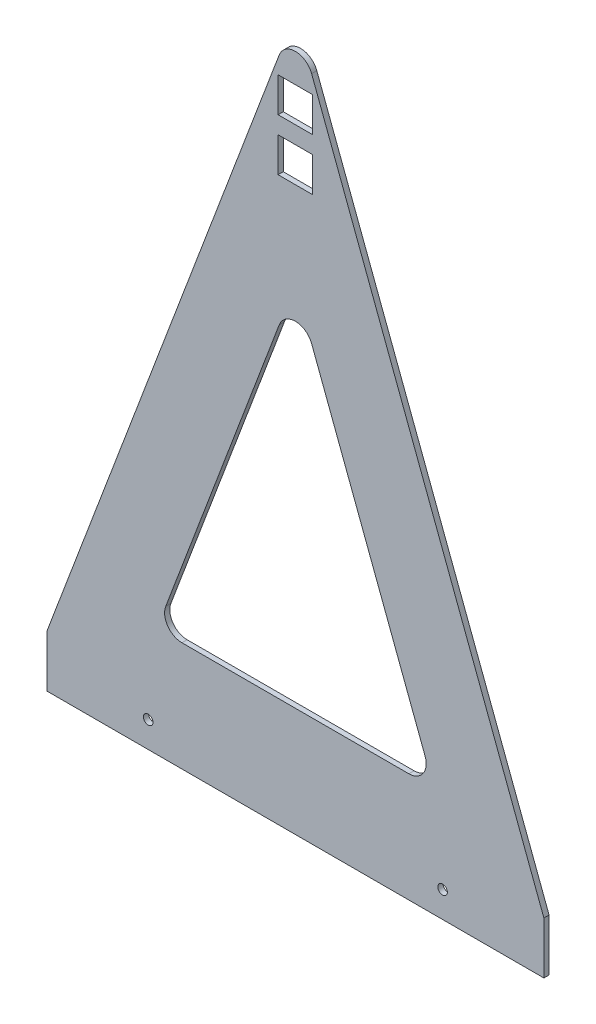
ISO-10303-21;
HEADER;
FILE_DESCRIPTION(('STEP AP214'),'2;1');
FILE_NAME('part.step','',(''),(''),'','','');
FILE_SCHEMA(('AUTOMOTIVE_DESIGN { 1 0 10303 214 1 1 1 1 }'));
ENDSEC;
DATA;
#1=APPLICATION_CONTEXT('core data for automotive mechanical design processes');
#2=APPLICATION_PROTOCOL_DEFINITION('international standard','automotive_design',2000,#1);
#3=PRODUCT_CONTEXT('',#1,'mechanical');
#4=PRODUCT('Part','Part','',(#3));
#5=PRODUCT_RELATED_PRODUCT_CATEGORY('part','',(#4));
#6=PRODUCT_DEFINITION_FORMATION('','',#4);
#7=PRODUCT_DEFINITION_CONTEXT('part definition',#1,'design');
#8=PRODUCT_DEFINITION('design','',#6,#7);
#9=PRODUCT_DEFINITION_SHAPE('','',#8);
#10=(LENGTH_UNIT() NAMED_UNIT(*) SI_UNIT(.MILLI.,.METRE.));
#11=(NAMED_UNIT(*) PLANE_ANGLE_UNIT() SI_UNIT($,.RADIAN.));
#12=(NAMED_UNIT(*) SI_UNIT($,.STERADIAN.) SOLID_ANGLE_UNIT());
#13=UNCERTAINTY_MEASURE_WITH_UNIT(LENGTH_MEASURE(1.E-05),#10,'distance_accuracy_value','');
#14=(GEOMETRIC_REPRESENTATION_CONTEXT(3) GLOBAL_UNCERTAINTY_ASSIGNED_CONTEXT((#13)) GLOBAL_UNIT_ASSIGNED_CONTEXT((#10,
#11,#12)) REPRESENTATION_CONTEXT('',''));
#15=CARTESIAN_POINT('',(0.,0.,0.));
#16=DIRECTION('',(0.,0.,1.));
#17=DIRECTION('',(1.,0.,0.));
#18=AXIS2_PLACEMENT_3D('',#15,#16,#17);
#19=CARTESIAN_POINT('',(0.,381.693910764514,3.));
#20=DIRECTION('',(0.,0.,1.));
#21=DIRECTION('',(1.,0.,0.));
#22=AXIS2_PLACEMENT_3D('',#19,#20,#21);
#23=PLANE('',#22);
#24=CARTESIAN_POINT('',(-65.5344110387045,73.1533101045285,3.));
#25=DIRECTION('',(0.,0.,-1.));
#26=DIRECTION('',(1.,0.,0.));
#27=AXIS2_PLACEMENT_3D('',#24,#25,#26);
#28=CIRCLE('',#27,10.);
#29=CARTESIAN_POINT('',(-65.5344110387045,63.1533101045285,3.));
#30=VERTEX_POINT('',#29);
#31=CARTESIAN_POINT('',(-74.8895840605347,76.686118864088,3.));
#32=VERTEX_POINT('',#31);
#33=EDGE_CURVE('E172',#30,#32,#28,.T.);
#34=ORIENTED_EDGE('',*,*,#33,.T.);
#35=DIRECTION('',(0.353280875955955,0.935517302183018,0.));
#36=VECTOR('',#35,1.);
#37=CARTESIAN_POINT('',(-9.35517302183021,250.226719524072,3.));
#38=LINE('',#37,#36);
#39=CARTESIAN_POINT('',(-9.35517302183022,250.226719524072,3.));
#40=VERTEX_POINT('',#39);
#41=EDGE_CURVE('E181',#32,#40,#38,.T.);
#42=ORIENTED_EDGE('',*,*,#41,.T.);
#43=CARTESIAN_POINT('',(0.,246.693910764513,3.));
#44=DIRECTION('',(0.,0.,-1.));
#45=DIRECTION('',(-1.,0.,0.));
#46=AXIS2_PLACEMENT_3D('',#43,#44,#45);
#47=CIRCLE('',#46,10.);
#48=CARTESIAN_POINT('',(9.35517302183021,250.226719524072,3.));
#49=VERTEX_POINT('',#48);
#50=EDGE_CURVE('E48',#40,#49,#47,.T.);
#51=ORIENTED_EDGE('',*,*,#50,.T.);
#52=DIRECTION('',(0.353280875955955,-0.935517302183018,0.));
#53=VECTOR('',#52,1.);
#54=CARTESIAN_POINT('',(9.35517302183021,250.226719524072,3.));
#55=LINE('',#54,#53);
#56=CARTESIAN_POINT('',(74.8895840605347,76.686118864088,3.));
#57=VERTEX_POINT('',#56);
#58=EDGE_CURVE('E195',#49,#57,#55,.T.);
#59=ORIENTED_EDGE('',*,*,#58,.T.);
#60=CARTESIAN_POINT('',(65.5344110387045,73.1533101045285,3.));
#61=DIRECTION('',(0.,0.,-1.));
#62=DIRECTION('',(-1.,0.,0.));
#63=AXIS2_PLACEMENT_3D('',#60,#61,#62);
#64=CIRCLE('',#63,10.);
#65=CARTESIAN_POINT('',(65.5344110387045,63.1533101045285,3.));
#66=VERTEX_POINT('',#65);
#67=EDGE_CURVE('E198',#57,#66,#64,.T.);
#68=ORIENTED_EDGE('',*,*,#67,.T.);
#69=DIRECTION('',(-1.,0.,0.));
#70=VECTOR('',#69,1.);
#71=CARTESIAN_POINT('',(-65.5344110387045,63.1533101045285,3.));
#72=LINE('',#71,#70);
#73=EDGE_CURVE('E178',#66,#30,#72,.T.);
#74=ORIENTED_EDGE('',*,*,#73,.T.);
#75=EDGE_LOOP('',(#34,#42,#51,#59,#68,#74));
#76=FACE_BOUND('',#75,.T.);
#77=CARTESIAN_POINT('',(85.,15.,3.));
#78=DIRECTION('',(0.,0.,-1.));
#79=DIRECTION('',(-1.,0.,0.));
#80=AXIS2_PLACEMENT_3D('',#77,#78,#79);
#81=CIRCLE('',#80,2.75);
#82=CARTESIAN_POINT('',(82.25,15.,3.));
#83=VERTEX_POINT('',#82);
#84=EDGE_CURVE('E224',#83,#83,#81,.T.);
#85=ORIENTED_EDGE('',*,*,#84,.T.);
#86=EDGE_LOOP('',(#85));
#87=FACE_BOUND('',#86,.T.);
#88=CARTESIAN_POINT('',(-85.,15.,3.));
#89=DIRECTION('',(0.,0.,-1.));
#90=DIRECTION('',(-1.,0.,0.));
#91=AXIS2_PLACEMENT_3D('',#88,#89,#90);
#92=CIRCLE('',#91,2.75);
#93=CARTESIAN_POINT('',(-87.75,15.,3.));
#94=VERTEX_POINT('',#93);
#95=EDGE_CURVE('E230',#94,#94,#92,.T.);
#96=ORIENTED_EDGE('',*,*,#95,.T.);
#97=EDGE_LOOP('',(#96));
#98=FACE_BOUND('',#97,.T.);
#99=DIRECTION('',(0.,1.,0.));
#100=VECTOR('',#99,1.);
#101=CARTESIAN_POINT('',(143.5,0.,3.));
#102=LINE('',#101,#100);
#103=CARTESIAN_POINT('',(143.5,0.,3.));
#104=VERTEX_POINT('',#103);
#105=CARTESIAN_POINT('',(143.5,30.,3.));
#106=VERTEX_POINT('',#105);
#107=EDGE_CURVE('E296',#104,#106,#102,.T.);
#108=ORIENTED_EDGE('',*,*,#107,.T.);
#109=DIRECTION('',(-0.353280875955956,0.935517302183018,0.));
#110=VECTOR('',#109,1.);
#111=CARTESIAN_POINT('',(143.5,30.,3.));
#112=LINE('',#111,#110);
#113=CARTESIAN_POINT('',(9.35517302183029,385.226719524073,3.));
#114=VERTEX_POINT('',#113);
#115=EDGE_CURVE('E299',#106,#114,#112,.T.);
#116=ORIENTED_EDGE('',*,*,#115,.T.);
#117=CARTESIAN_POINT('',(0.,381.693910764514,3.));
#118=DIRECTION('',(0.,0.,1.));
#119=DIRECTION('',(1.,0.,0.));
#120=AXIS2_PLACEMENT_3D('',#117,#118,#119);
#121=CIRCLE('',#120,10.);
#122=CARTESIAN_POINT('',(-9.35517302183028,385.226719524073,3.));
#123=VERTEX_POINT('',#122);
#124=EDGE_CURVE('E302',#114,#123,#121,.T.);
#125=ORIENTED_EDGE('',*,*,#124,.T.);
#126=DIRECTION('',(-0.353280875955955,-0.935517302183018,0.));
#127=VECTOR('',#126,1.);
#128=CARTESIAN_POINT('',(-143.5,29.9999999999991,3.));
#129=LINE('',#128,#127);
#130=CARTESIAN_POINT('',(-143.5,29.9999999999991,3.));
#131=VERTEX_POINT('',#130);
#132=EDGE_CURVE('E304',#123,#131,#129,.T.);
#133=ORIENTED_EDGE('',*,*,#132,.T.);
#134=DIRECTION('',(0.,-1.,0.));
#135=VECTOR('',#134,1.);
#136=CARTESIAN_POINT('',(-143.5,-8.88178419700125E-13,3.));
#137=LINE('',#136,#135);
#138=CARTESIAN_POINT('',(-143.5,-8.88178419700125E-13,3.));
#139=VERTEX_POINT('',#138);
#140=EDGE_CURVE('E306',#131,#139,#137,.T.);
#141=ORIENTED_EDGE('',*,*,#140,.T.);
#142=DIRECTION('',(1.,0.,0.));
#143=VECTOR('',#142,1.);
#144=CARTESIAN_POINT('',(-143.5,-8.88178419700125E-13,3.));
#145=LINE('',#144,#143);
#146=EDGE_CURVE('E308',#139,#104,#145,.T.);
#147=ORIENTED_EDGE('',*,*,#146,.T.);
#148=EDGE_LOOP('',(#108,#116,#125,#133,#141,#147));
#149=FACE_BOUND('',#148,.T.);
#150=DIRECTION('',(-1.,0.,0.));
#151=VECTOR('',#150,1.);
#152=CARTESIAN_POINT('',(-10.0000000000106,374.999999999999,3.));
#153=LINE('',#152,#151);
#154=CARTESIAN_POINT('',(9.99999999998945,374.999999999999,3.));
#155=VERTEX_POINT('',#154);
#156=CARTESIAN_POINT('',(-10.0000000000106,374.999999999999,3.));
#157=VERTEX_POINT('',#156);
#158=EDGE_CURVE('E267',#155,#157,#153,.T.);
#159=ORIENTED_EDGE('',*,*,#158,.F.);
#160=DIRECTION('',(0.,1.,0.));
#161=VECTOR('',#160,1.);
#162=CARTESIAN_POINT('',(9.99999999998945,374.999999999999,3.));
#163=LINE('',#162,#161);
#164=CARTESIAN_POINT('',(9.99999999998946,354.999999999999,3.));
#165=VERTEX_POINT('',#164);
#166=EDGE_CURVE('E265',#165,#155,#163,.T.);
#167=ORIENTED_EDGE('',*,*,#166,.F.);
#168=DIRECTION('',(1.,0.,0.));
#169=VECTOR('',#168,1.);
#170=CARTESIAN_POINT('',(-10.0000000000105,354.999999999999,3.));
#171=LINE('',#170,#169);
#172=CARTESIAN_POINT('',(-10.0000000000105,354.999999999999,3.));
#173=VERTEX_POINT('',#172);
#174=EDGE_CURVE('E273',#173,#165,#171,.T.);
#175=ORIENTED_EDGE('',*,*,#174,.F.);
#176=DIRECTION('',(0.,-1.,0.));
#177=VECTOR('',#176,1.);
#178=CARTESIAN_POINT('',(-10.0000000000106,374.999999999999,3.));
#179=LINE('',#178,#177);
#180=EDGE_CURVE('E270',#157,#173,#179,.T.);
#181=ORIENTED_EDGE('',*,*,#180,.F.);
#182=EDGE_LOOP('',(#159,#167,#175,#181));
#183=FACE_BOUND('',#182,.T.);
#184=DIRECTION('',(-1.,0.,0.));
#185=VECTOR('',#184,1.);
#186=CARTESIAN_POINT('',(-10.,345.,3.));
#187=LINE('',#186,#185);
#188=CARTESIAN_POINT('',(9.99999999998114,345.,3.));
#189=VERTEX_POINT('',#188);
#190=CARTESIAN_POINT('',(-10.,345.,3.));
#191=VERTEX_POINT('',#190);
#192=EDGE_CURVE('E236',#189,#191,#187,.T.);
#193=ORIENTED_EDGE('',*,*,#192,.F.);
#194=DIRECTION('',(0.,1.,0.));
#195=VECTOR('',#194,1.);
#196=CARTESIAN_POINT('',(9.99999999998114,345.,3.));
#197=LINE('',#196,#195);
#198=CARTESIAN_POINT('',(9.99999999998114,325.,3.));
#199=VERTEX_POINT('',#198);
#200=EDGE_CURVE('E234',#199,#189,#197,.T.);
#201=ORIENTED_EDGE('',*,*,#200,.F.);
#202=DIRECTION('',(1.,0.,0.));
#203=VECTOR('',#202,1.);
#204=CARTESIAN_POINT('',(-9.99999999999999,325.,3.));
#205=LINE('',#204,#203);
#206=CARTESIAN_POINT('',(-9.99999999999999,325.,3.));
#207=VERTEX_POINT('',#206);
#208=EDGE_CURVE('E242',#207,#199,#205,.T.);
#209=ORIENTED_EDGE('',*,*,#208,.F.);
#210=DIRECTION('',(0.,-1.,0.));
#211=VECTOR('',#210,1.);
#212=CARTESIAN_POINT('',(-10.,345.,3.));
#213=LINE('',#212,#211);
#214=EDGE_CURVE('E239',#191,#207,#213,.T.);
#215=ORIENTED_EDGE('',*,*,#214,.F.);
#216=EDGE_LOOP('',(#193,#201,#209,#215));
#217=FACE_BOUND('',#216,.T.);
#218=ADVANCED_FACE('F33',(#76,#87,#98,#149,#183,#217),#23,.T.);
#219=CARTESIAN_POINT('',(0.,381.693910764514,0.));
#220=DIRECTION('',(0.,0.,1.));
#221=DIRECTION('',(1.,0.,0.));
#222=AXIS2_PLACEMENT_3D('',#219,#220,#221);
#223=PLANE('',#222);
#224=DIRECTION('',(0.353280875955955,0.935517302183018,0.));
#225=VECTOR('',#224,1.);
#226=CARTESIAN_POINT('',(-9.35517302183021,250.226719524072,0.));
#227=LINE('',#226,#225);
#228=CARTESIAN_POINT('',(-74.8895840605347,76.686118864088,0.));
#229=VERTEX_POINT('',#228);
#230=CARTESIAN_POINT('',(-9.35517302183021,250.226719524072,0.));
#231=VERTEX_POINT('',#230);
#232=EDGE_CURVE('E202',#229,#231,#227,.T.);
#233=ORIENTED_EDGE('',*,*,#232,.F.);
#234=CARTESIAN_POINT('',(-65.5344110387045,73.1533101045285,0.));
#235=DIRECTION('',(0.,0.,-1.));
#236=DIRECTION('',(1.,0.,0.));
#237=AXIS2_PLACEMENT_3D('',#234,#235,#236);
#238=CIRCLE('',#237,10.);
#239=CARTESIAN_POINT('',(-65.5344110387045,63.1533101045285,0.));
#240=VERTEX_POINT('',#239);
#241=EDGE_CURVE('E56',#240,#229,#238,.T.);
#242=ORIENTED_EDGE('',*,*,#241,.F.);
#243=DIRECTION('',(-1.,0.,0.));
#244=VECTOR('',#243,1.);
#245=CARTESIAN_POINT('',(-65.5344110387045,63.1533101045285,0.));
#246=LINE('',#245,#244);
#247=CARTESIAN_POINT('',(65.5344110387045,63.1533101045285,0.));
#248=VERTEX_POINT('',#247);
#249=EDGE_CURVE('E188',#248,#240,#246,.T.);
#250=ORIENTED_EDGE('',*,*,#249,.F.);
#251=CARTESIAN_POINT('',(65.5344110387045,73.1533101045285,0.));
#252=DIRECTION('',(0.,0.,-1.));
#253=DIRECTION('',(-1.,0.,0.));
#254=AXIS2_PLACEMENT_3D('',#251,#252,#253);
#255=CIRCLE('',#254,10.);
#256=CARTESIAN_POINT('',(74.8895840605347,76.686118864088,0.));
#257=VERTEX_POINT('',#256);
#258=EDGE_CURVE('E191',#257,#248,#255,.T.);
#259=ORIENTED_EDGE('',*,*,#258,.F.);
#260=DIRECTION('',(0.353280875955955,-0.935517302183018,0.));
#261=VECTOR('',#260,1.);
#262=CARTESIAN_POINT('',(9.35517302183021,250.226719524072,0.));
#263=LINE('',#262,#261);
#264=CARTESIAN_POINT('',(9.35517302183021,250.226719524072,0.));
#265=VERTEX_POINT('',#264);
#266=EDGE_CURVE('E207',#265,#257,#263,.T.);
#267=ORIENTED_EDGE('',*,*,#266,.F.);
#268=CARTESIAN_POINT('',(0.,246.693910764513,0.));
#269=DIRECTION('',(0.,0.,-1.));
#270=DIRECTION('',(-1.,0.,0.));
#271=AXIS2_PLACEMENT_3D('',#268,#269,#270);
#272=CIRCLE('',#271,10.);
#273=EDGE_CURVE('E204',#231,#265,#272,.T.);
#274=ORIENTED_EDGE('',*,*,#273,.F.);
#275=EDGE_LOOP('',(#233,#242,#250,#259,#267,#274));
#276=FACE_BOUND('',#275,.T.);
#277=CARTESIAN_POINT('',(85.,15.,0.));
#278=DIRECTION('',(0.,0.,-1.));
#279=DIRECTION('',(-1.,0.,0.));
#280=AXIS2_PLACEMENT_3D('',#277,#278,#279);
#281=CIRCLE('',#280,2.75);
#282=CARTESIAN_POINT('',(82.25,15.,0.));
#283=VERTEX_POINT('',#282);
#284=EDGE_CURVE('E214',#283,#283,#281,.T.);
#285=ORIENTED_EDGE('',*,*,#284,.F.);
#286=EDGE_LOOP('',(#285));
#287=FACE_BOUND('',#286,.T.);
#288=CARTESIAN_POINT('',(-85.,15.,0.));
#289=DIRECTION('',(0.,0.,-1.));
#290=DIRECTION('',(-1.,0.,0.));
#291=AXIS2_PLACEMENT_3D('',#288,#289,#290);
#292=CIRCLE('',#291,2.75);
#293=CARTESIAN_POINT('',(-87.75,15.,0.));
#294=VERTEX_POINT('',#293);
#295=EDGE_CURVE('E227',#294,#294,#292,.T.);
#296=ORIENTED_EDGE('',*,*,#295,.F.);
#297=EDGE_LOOP('',(#296));
#298=FACE_BOUND('',#297,.T.);
#299=DIRECTION('',(0.,1.,0.));
#300=VECTOR('',#299,1.);
#301=CARTESIAN_POINT('',(9.99999999998945,374.999999999999,0.));
#302=LINE('',#301,#300);
#303=CARTESIAN_POINT('',(9.99999999998946,354.999999999999,0.));
#304=VERTEX_POINT('',#303);
#305=CARTESIAN_POINT('',(9.99999999998945,374.999999999999,0.));
#306=VERTEX_POINT('',#305);
#307=EDGE_CURVE('E264',#304,#306,#302,.T.);
#308=ORIENTED_EDGE('',*,*,#307,.T.);
#309=DIRECTION('',(-1.,0.,0.));
#310=VECTOR('',#309,1.);
#311=CARTESIAN_POINT('',(-10.0000000000106,374.999999999999,0.));
#312=LINE('',#311,#310);
#313=CARTESIAN_POINT('',(-10.0000000000106,374.999999999999,0.));
#314=VERTEX_POINT('',#313);
#315=EDGE_CURVE('E278',#306,#314,#312,.T.);
#316=ORIENTED_EDGE('',*,*,#315,.T.);
#317=DIRECTION('',(0.,-1.,0.));
#318=VECTOR('',#317,1.);
#319=CARTESIAN_POINT('',(-10.0000000000106,374.999999999999,0.));
#320=LINE('',#319,#318);
#321=CARTESIAN_POINT('',(-10.0000000000105,354.999999999999,0.));
#322=VERTEX_POINT('',#321);
#323=EDGE_CURVE('E281',#314,#322,#320,.T.);
#324=ORIENTED_EDGE('',*,*,#323,.T.);
#325=DIRECTION('',(1.,0.,0.));
#326=VECTOR('',#325,1.);
#327=CARTESIAN_POINT('',(-10.0000000000105,354.999999999999,0.));
#328=LINE('',#327,#326);
#329=EDGE_CURVE('E268',#322,#304,#328,.T.);
#330=ORIENTED_EDGE('',*,*,#329,.T.);
#331=EDGE_LOOP('',(#308,#316,#324,#330));
#332=FACE_BOUND('',#331,.T.);
#333=DIRECTION('',(0.,1.,0.));
#334=VECTOR('',#333,1.);
#335=CARTESIAN_POINT('',(143.5,0.,0.));
#336=LINE('',#335,#334);
#337=CARTESIAN_POINT('',(143.5,0.,0.));
#338=VERTEX_POINT('',#337);
#339=CARTESIAN_POINT('',(143.5,30.,0.));
#340=VERTEX_POINT('',#339);
#341=EDGE_CURVE('E295',#338,#340,#336,.T.);
#342=ORIENTED_EDGE('',*,*,#341,.F.);
#343=DIRECTION('',(1.,0.,0.));
#344=VECTOR('',#343,1.);
#345=CARTESIAN_POINT('',(-143.5,-8.88178419700125E-13,0.));
#346=LINE('',#345,#344);
#347=CARTESIAN_POINT('',(-143.5,-8.88178419700125E-13,0.));
#348=VERTEX_POINT('',#347);
#349=EDGE_CURVE('E300',#348,#338,#346,.T.);
#350=ORIENTED_EDGE('',*,*,#349,.F.);
#351=DIRECTION('',(0.,-1.,0.));
#352=VECTOR('',#351,1.);
#353=CARTESIAN_POINT('',(-143.5,-8.88178419700125E-13,0.));
#354=LINE('',#353,#352);
#355=CARTESIAN_POINT('',(-143.5,29.9999999999991,0.));
#356=VERTEX_POINT('',#355);
#357=EDGE_CURVE('E319',#356,#348,#354,.T.);
#358=ORIENTED_EDGE('',*,*,#357,.F.);
#359=DIRECTION('',(-0.353280875955955,-0.935517302183018,0.));
#360=VECTOR('',#359,1.);
#361=CARTESIAN_POINT('',(-143.5,29.9999999999991,0.));
#362=LINE('',#361,#360);
#363=CARTESIAN_POINT('',(-9.35517302183028,385.226719524073,0.));
#364=VERTEX_POINT('',#363);
#365=EDGE_CURVE('E317',#364,#356,#362,.T.);
#366=ORIENTED_EDGE('',*,*,#365,.F.);
#367=CARTESIAN_POINT('',(0.,381.693910764514,0.));
#368=DIRECTION('',(0.,0.,1.));
#369=DIRECTION('',(1.,0.,0.));
#370=AXIS2_PLACEMENT_3D('',#367,#368,#369);
#371=CIRCLE('',#370,10.);
#372=CARTESIAN_POINT('',(9.35517302183029,385.226719524073,0.));
#373=VERTEX_POINT('',#372);
#374=EDGE_CURVE('E315',#373,#364,#371,.T.);
#375=ORIENTED_EDGE('',*,*,#374,.F.);
#376=DIRECTION('',(-0.353280875955956,0.935517302183018,0.));
#377=VECTOR('',#376,1.);
#378=CARTESIAN_POINT('',(143.5,30.,0.));
#379=LINE('',#378,#377);
#380=EDGE_CURVE('E313',#340,#373,#379,.T.);
#381=ORIENTED_EDGE('',*,*,#380,.F.);
#382=EDGE_LOOP('',(#342,#350,#358,#366,#375,#381));
#383=FACE_BOUND('',#382,.T.);
#384=DIRECTION('',(0.,1.,0.));
#385=VECTOR('',#384,1.);
#386=CARTESIAN_POINT('',(9.99999999998114,345.,0.));
#387=LINE('',#386,#385);
#388=CARTESIAN_POINT('',(9.99999999998114,325.,0.));
#389=VERTEX_POINT('',#388);
#390=CARTESIAN_POINT('',(9.99999999998114,345.,0.));
#391=VERTEX_POINT('',#390);
#392=EDGE_CURVE('E233',#389,#391,#387,.T.);
#393=ORIENTED_EDGE('',*,*,#392,.T.);
#394=DIRECTION('',(-1.,0.,0.));
#395=VECTOR('',#394,1.);
#396=CARTESIAN_POINT('',(-10.,345.,0.));
#397=LINE('',#396,#395);
#398=CARTESIAN_POINT('',(-10.,345.,0.));
#399=VERTEX_POINT('',#398);
#400=EDGE_CURVE('E247',#391,#399,#397,.T.);
#401=ORIENTED_EDGE('',*,*,#400,.T.);
#402=DIRECTION('',(0.,-1.,0.));
#403=VECTOR('',#402,1.);
#404=CARTESIAN_POINT('',(-10.,345.,0.));
#405=LINE('',#404,#403);
#406=CARTESIAN_POINT('',(-9.99999999999999,325.,0.));
#407=VERTEX_POINT('',#406);
#408=EDGE_CURVE('E250',#399,#407,#405,.T.);
#409=ORIENTED_EDGE('',*,*,#408,.T.);
#410=DIRECTION('',(1.,0.,0.));
#411=VECTOR('',#410,1.);
#412=CARTESIAN_POINT('',(-9.99999999999999,325.,0.));
#413=LINE('',#412,#411);
#414=EDGE_CURVE('E237',#407,#389,#413,.T.);
#415=ORIENTED_EDGE('',*,*,#414,.T.);
#416=EDGE_LOOP('',(#393,#401,#409,#415));
#417=FACE_BOUND('',#416,.T.);
#418=ADVANCED_FACE('F343',(#276,#287,#298,#332,#383,#417),#223,.F.);
#419=CARTESIAN_POINT('',(143.5,0.,3.));
#420=DIRECTION('',(-1.,0.,0.));
#421=DIRECTION('',(0.,0.,1.));
#422=AXIS2_PLACEMENT_3D('',#419,#420,#421);
#423=PLANE('',#422);
#424=ORIENTED_EDGE('',*,*,#341,.T.);
#425=DIRECTION('',(0.,0.,-1.));
#426=VECTOR('',#425,1.);
#427=CARTESIAN_POINT('',(143.5,30.,3.));
#428=LINE('',#427,#426);
#429=EDGE_CURVE('E11',#106,#340,#428,.T.);
#430=ORIENTED_EDGE('',*,*,#429,.F.);
#431=ORIENTED_EDGE('',*,*,#107,.F.);
#432=DIRECTION('',(0.,0.,-1.));
#433=VECTOR('',#432,1.);
#434=CARTESIAN_POINT('',(143.5,0.,3.));
#435=LINE('',#434,#433);
#436=EDGE_CURVE('E310',#104,#338,#435,.T.);
#437=ORIENTED_EDGE('',*,*,#436,.T.);
#438=EDGE_LOOP('',(#424,#430,#431,#437));
#439=FACE_BOUND('',#438,.T.);
#440=ADVANCED_FACE('F35',(#439),#423,.F.);
#441=CARTESIAN_POINT('',(143.5,30.,3.));
#442=DIRECTION('',(-0.935517302183018,-0.353280875955956,0.));
#443=DIRECTION('',(0.353280875955956,-0.935517302183018,0.));
#444=AXIS2_PLACEMENT_3D('',#441,#442,#443);
#445=PLANE('',#444);
#446=ORIENTED_EDGE('',*,*,#380,.T.);
#447=DIRECTION('',(0.,0.,-1.));
#448=VECTOR('',#447,1.);
#449=CARTESIAN_POINT('',(9.35517302183029,385.226719524073,3.));
#450=LINE('',#449,#448);
#451=EDGE_CURVE('E41',#114,#373,#450,.T.);
#452=ORIENTED_EDGE('',*,*,#451,.F.);
#453=ORIENTED_EDGE('',*,*,#115,.F.);
#454=ORIENTED_EDGE('',*,*,#429,.T.);
#455=EDGE_LOOP('',(#446,#452,#453,#454));
#456=FACE_BOUND('',#455,.T.);
#457=ADVANCED_FACE('F361',(#456),#445,.F.);
#458=CARTESIAN_POINT('',(0.,381.693910764514,3.));
#459=DIRECTION('',(0.,0.,-1.));
#460=DIRECTION('',(-1.,0.,0.));
#461=AXIS2_PLACEMENT_3D('',#458,#459,#460);
#462=CYLINDRICAL_SURFACE('',#461,10.);
#463=ORIENTED_EDGE('',*,*,#374,.T.);
#464=DIRECTION('',(0.,0.,-1.));
#465=VECTOR('',#464,1.);
#466=CARTESIAN_POINT('',(-9.35517302183028,385.226719524073,3.));
#467=LINE('',#466,#465);
#468=EDGE_CURVE('E330',#123,#364,#467,.T.);
#469=ORIENTED_EDGE('',*,*,#468,.F.);
#470=ORIENTED_EDGE('',*,*,#124,.F.);
#471=ORIENTED_EDGE('',*,*,#451,.T.);
#472=EDGE_LOOP('',(#463,#469,#470,#471));
#473=FACE_BOUND('',#472,.T.);
#474=ADVANCED_FACE('F337',(#473),#462,.T.);
#475=CARTESIAN_POINT('',(-143.5,29.9999999999991,3.));
#476=DIRECTION('',(0.935517302183018,-0.353280875955955,0.));
#477=DIRECTION('',(0.353280875955955,0.935517302183019,0.));
#478=AXIS2_PLACEMENT_3D('',#475,#476,#477);
#479=PLANE('',#478);
#480=ORIENTED_EDGE('',*,*,#365,.T.);
#481=DIRECTION('',(0.,0.,-1.));
#482=VECTOR('',#481,1.);
#483=CARTESIAN_POINT('',(-143.5,29.9999999999991,3.));
#484=LINE('',#483,#482);
#485=EDGE_CURVE('E327',#131,#356,#484,.T.);
#486=ORIENTED_EDGE('',*,*,#485,.F.);
#487=ORIENTED_EDGE('',*,*,#132,.F.);
#488=ORIENTED_EDGE('',*,*,#468,.T.);
#489=EDGE_LOOP('',(#480,#486,#487,#488));
#490=FACE_BOUND('',#489,.T.);
#491=ADVANCED_FACE('F349',(#490),#479,.F.);
#492=CARTESIAN_POINT('',(-143.5,-8.88178419700125E-13,3.));
#493=DIRECTION('',(1.,0.,0.));
#494=DIRECTION('',(0.,1.,0.));
#495=AXIS2_PLACEMENT_3D('',#492,#493,#494);
#496=PLANE('',#495);
#497=ORIENTED_EDGE('',*,*,#357,.T.);
#498=DIRECTION('',(0.,0.,-1.));
#499=VECTOR('',#498,1.);
#500=CARTESIAN_POINT('',(-143.5,-8.88178419700125E-13,3.));
#501=LINE('',#500,#499);
#502=EDGE_CURVE('E324',#139,#348,#501,.T.);
#503=ORIENTED_EDGE('',*,*,#502,.F.);
#504=ORIENTED_EDGE('',*,*,#140,.F.);
#505=ORIENTED_EDGE('',*,*,#485,.T.);
#506=EDGE_LOOP('',(#497,#503,#504,#505));
#507=FACE_BOUND('',#506,.T.);
#508=ADVANCED_FACE('F353',(#507),#496,.F.);
#509=CARTESIAN_POINT('',(-143.5,-8.88178419700125E-13,3.));
#510=DIRECTION('',(0.,1.,0.));
#511=DIRECTION('',(-1.,0.,0.));
#512=AXIS2_PLACEMENT_3D('',#509,#510,#511);
#513=PLANE('',#512);
#514=ORIENTED_EDGE('',*,*,#349,.T.);
#515=ORIENTED_EDGE('',*,*,#436,.F.);
#516=ORIENTED_EDGE('',*,*,#146,.F.);
#517=ORIENTED_EDGE('',*,*,#502,.T.);
#518=EDGE_LOOP('',(#514,#515,#516,#517));
#519=FACE_BOUND('',#518,.T.);
#520=ADVANCED_FACE('F364',(#519),#513,.F.);
#521=CARTESIAN_POINT('',(9.99999999998945,374.999999999999,3.));
#522=DIRECTION('',(-1.,0.,0.));
#523=DIRECTION('',(0.,-1.,0.));
#524=AXIS2_PLACEMENT_3D('',#521,#522,#523);
#525=PLANE('',#524);
#526=ORIENTED_EDGE('',*,*,#307,.F.);
#527=DIRECTION('',(0.,0.,-1.));
#528=VECTOR('',#527,1.);
#529=CARTESIAN_POINT('',(9.99999999998946,354.999999999999,3.));
#530=LINE('',#529,#528);
#531=EDGE_CURVE('E275',#165,#304,#530,.T.);
#532=ORIENTED_EDGE('',*,*,#531,.F.);
#533=ORIENTED_EDGE('',*,*,#166,.T.);
#534=DIRECTION('',(0.,0.,-1.));
#535=VECTOR('',#534,1.);
#536=CARTESIAN_POINT('',(9.99999999998945,374.999999999999,3.));
#537=LINE('',#536,#535);
#538=EDGE_CURVE('E292',#155,#306,#537,.T.);
#539=ORIENTED_EDGE('',*,*,#538,.T.);
#540=EDGE_LOOP('',(#526,#532,#533,#539));
#541=FACE_BOUND('',#540,.T.);
#542=ADVANCED_FACE('F366',(#541),#525,.T.);
#543=CARTESIAN_POINT('',(-10.0000000000106,374.999999999999,3.));
#544=DIRECTION('',(0.,-1.,0.));
#545=DIRECTION('',(0.,0.,-1.));
#546=AXIS2_PLACEMENT_3D('',#543,#544,#545);
#547=PLANE('',#546);
#548=ORIENTED_EDGE('',*,*,#315,.F.);
#549=ORIENTED_EDGE('',*,*,#538,.F.);
#550=ORIENTED_EDGE('',*,*,#158,.T.);
#551=DIRECTION('',(0.,0.,-1.));
#552=VECTOR('',#551,1.);
#553=CARTESIAN_POINT('',(-10.0000000000106,374.999999999999,3.));
#554=LINE('',#553,#552);
#555=EDGE_CURVE('E290',#157,#314,#554,.T.);
#556=ORIENTED_EDGE('',*,*,#555,.T.);
#557=EDGE_LOOP('',(#548,#549,#550,#556));
#558=FACE_BOUND('',#557,.T.);
#559=ADVANCED_FACE('F372',(#558),#547,.T.);
#560=CARTESIAN_POINT('',(-10.0000000000106,374.999999999999,3.));
#561=DIRECTION('',(1.,0.,0.));
#562=DIRECTION('',(0.,1.,0.));
#563=AXIS2_PLACEMENT_3D('',#560,#561,#562);
#564=PLANE('',#563);
#565=ORIENTED_EDGE('',*,*,#323,.F.);
#566=ORIENTED_EDGE('',*,*,#555,.F.);
#567=ORIENTED_EDGE('',*,*,#180,.T.);
#568=DIRECTION('',(0.,0.,-1.));
#569=VECTOR('',#568,1.);
#570=CARTESIAN_POINT('',(-10.0000000000105,354.999999999999,3.));
#571=LINE('',#570,#569);
#572=EDGE_CURVE('E288',#173,#322,#571,.T.);
#573=ORIENTED_EDGE('',*,*,#572,.T.);
#574=EDGE_LOOP('',(#565,#566,#567,#573));
#575=FACE_BOUND('',#574,.T.);
#576=ADVANCED_FACE('F386',(#575),#564,.T.);
#577=CARTESIAN_POINT('',(-10.0000000000105,354.999999999999,3.));
#578=DIRECTION('',(0.,1.,0.));
#579=DIRECTION('',(0.,0.,1.));
#580=AXIS2_PLACEMENT_3D('',#577,#578,#579);
#581=PLANE('',#580);
#582=ORIENTED_EDGE('',*,*,#329,.F.);
#583=ORIENTED_EDGE('',*,*,#572,.F.);
#584=ORIENTED_EDGE('',*,*,#174,.T.);
#585=ORIENTED_EDGE('',*,*,#531,.T.);
#586=EDGE_LOOP('',(#582,#583,#584,#585));
#587=FACE_BOUND('',#586,.T.);
#588=ADVANCED_FACE('F390',(#587),#581,.T.);
#589=CARTESIAN_POINT('',(9.99999999998114,345.,3.));
#590=DIRECTION('',(-1.,0.,0.));
#591=DIRECTION('',(0.,-1.,0.));
#592=AXIS2_PLACEMENT_3D('',#589,#590,#591);
#593=PLANE('',#592);
#594=ORIENTED_EDGE('',*,*,#392,.F.);
#595=DIRECTION('',(0.,0.,-1.));
#596=VECTOR('',#595,1.);
#597=CARTESIAN_POINT('',(9.99999999998114,325.,3.));
#598=LINE('',#597,#596);
#599=EDGE_CURVE('E244',#199,#389,#598,.T.);
#600=ORIENTED_EDGE('',*,*,#599,.F.);
#601=ORIENTED_EDGE('',*,*,#200,.T.);
#602=DIRECTION('',(0.,0.,-1.));
#603=VECTOR('',#602,1.);
#604=CARTESIAN_POINT('',(9.99999999998114,345.,3.));
#605=LINE('',#604,#603);
#606=EDGE_CURVE('E261',#189,#391,#605,.T.);
#607=ORIENTED_EDGE('',*,*,#606,.T.);
#608=EDGE_LOOP('',(#594,#600,#601,#607));
#609=FACE_BOUND('',#608,.T.);
#610=ADVANCED_FACE('F394',(#609),#593,.T.);
#611=CARTESIAN_POINT('',(-10.,345.,3.));
#612=DIRECTION('',(0.,-1.,0.));
#613=DIRECTION('',(0.,0.,-1.));
#614=AXIS2_PLACEMENT_3D('',#611,#612,#613);
#615=PLANE('',#614);
#616=ORIENTED_EDGE('',*,*,#400,.F.);
#617=ORIENTED_EDGE('',*,*,#606,.F.);
#618=ORIENTED_EDGE('',*,*,#192,.T.);
#619=DIRECTION('',(0.,0.,-1.));
#620=VECTOR('',#619,1.);
#621=CARTESIAN_POINT('',(-10.,345.,3.));
#622=LINE('',#621,#620);
#623=EDGE_CURVE('E259',#191,#399,#622,.T.);
#624=ORIENTED_EDGE('',*,*,#623,.T.);
#625=EDGE_LOOP('',(#616,#617,#618,#624));
#626=FACE_BOUND('',#625,.T.);
#627=ADVANCED_FACE('F398',(#626),#615,.T.);
#628=CARTESIAN_POINT('',(-10.,345.,3.));
#629=DIRECTION('',(1.,0.,0.));
#630=DIRECTION('',(0.,1.,0.));
#631=AXIS2_PLACEMENT_3D('',#628,#629,#630);
#632=PLANE('',#631);
#633=ORIENTED_EDGE('',*,*,#408,.F.);
#634=ORIENTED_EDGE('',*,*,#623,.F.);
#635=ORIENTED_EDGE('',*,*,#214,.T.);
#636=DIRECTION('',(0.,0.,-1.));
#637=VECTOR('',#636,1.);
#638=CARTESIAN_POINT('',(-9.99999999999999,325.,3.));
#639=LINE('',#638,#637);
#640=EDGE_CURVE('E257',#207,#407,#639,.T.);
#641=ORIENTED_EDGE('',*,*,#640,.T.);
#642=EDGE_LOOP('',(#633,#634,#635,#641));
#643=FACE_BOUND('',#642,.T.);
#644=ADVANCED_FACE('F402',(#643),#632,.T.);
#645=CARTESIAN_POINT('',(-9.99999999999999,325.,3.));
#646=DIRECTION('',(0.,1.,0.));
#647=DIRECTION('',(0.,0.,1.));
#648=AXIS2_PLACEMENT_3D('',#645,#646,#647);
#649=PLANE('',#648);
#650=ORIENTED_EDGE('',*,*,#414,.F.);
#651=ORIENTED_EDGE('',*,*,#640,.F.);
#652=ORIENTED_EDGE('',*,*,#208,.T.);
#653=ORIENTED_EDGE('',*,*,#599,.T.);
#654=EDGE_LOOP('',(#650,#651,#652,#653));
#655=FACE_BOUND('',#654,.T.);
#656=ADVANCED_FACE('F406',(#655),#649,.T.);
#657=CARTESIAN_POINT('',(-85.,15.,0.));
#658=DIRECTION('',(0.,0.,-1.));
#659=DIRECTION('',(-1.,0.,0.));
#660=AXIS2_PLACEMENT_3D('',#657,#658,#659);
#661=CYLINDRICAL_SURFACE('',#660,2.75);
#662=ORIENTED_EDGE('',*,*,#95,.F.);
#663=EDGE_LOOP('',(#662));
#664=FACE_BOUND('',#663,.T.);
#665=ORIENTED_EDGE('',*,*,#295,.T.);
#666=EDGE_LOOP('',(#665));
#667=FACE_BOUND('',#666,.T.);
#668=ADVANCED_FACE('F410',(#664,#667),#661,.F.);
#669=CARTESIAN_POINT('',(85.,15.,0.));
#670=DIRECTION('',(0.,0.,-1.));
#671=DIRECTION('',(-1.,0.,0.));
#672=AXIS2_PLACEMENT_3D('',#669,#670,#671);
#673=CYLINDRICAL_SURFACE('',#672,2.75);
#674=ORIENTED_EDGE('',*,*,#84,.F.);
#675=EDGE_LOOP('',(#674));
#676=FACE_BOUND('',#675,.T.);
#677=ORIENTED_EDGE('',*,*,#284,.T.);
#678=EDGE_LOOP('',(#677));
#679=FACE_BOUND('',#678,.T.);
#680=ADVANCED_FACE('F414',(#676,#679),#673,.F.);
#681=CARTESIAN_POINT('',(-65.5344110387045,73.1533101045285,3.));
#682=DIRECTION('',(0.,0.,-1.));
#683=DIRECTION('',(-1.,0.,0.));
#684=AXIS2_PLACEMENT_3D('',#681,#682,#683);
#685=CYLINDRICAL_SURFACE('',#684,10.);
#686=ORIENTED_EDGE('',*,*,#241,.T.);
#687=DIRECTION('',(0.,0.,-1.));
#688=VECTOR('',#687,1.);
#689=CARTESIAN_POINT('',(-74.8895840605347,76.686118864088,3.));
#690=LINE('',#689,#688);
#691=EDGE_CURVE('E168',#32,#229,#690,.T.);
#692=ORIENTED_EDGE('',*,*,#691,.F.);
#693=ORIENTED_EDGE('',*,*,#33,.F.);
#694=DIRECTION('',(0.,0.,-1.));
#695=VECTOR('',#694,1.);
#696=CARTESIAN_POINT('',(-65.5344110387045,63.1533101045285,3.));
#697=LINE('',#696,#695);
#698=EDGE_CURVE('E212',#30,#240,#697,.T.);
#699=ORIENTED_EDGE('',*,*,#698,.T.);
#700=EDGE_LOOP('',(#686,#692,#693,#699));
#701=FACE_BOUND('',#700,.T.);
#702=ADVANCED_FACE('F170',(#701),#685,.F.);
#703=CARTESIAN_POINT('',(-65.5344110387045,63.1533101045285,3.));
#704=DIRECTION('',(0.,-1.,0.));
#705=DIRECTION('',(0.,0.,-1.));
#706=AXIS2_PLACEMENT_3D('',#703,#704,#705);
#707=PLANE('',#706);
#708=ORIENTED_EDGE('',*,*,#249,.T.);
#709=ORIENTED_EDGE('',*,*,#698,.F.);
#710=ORIENTED_EDGE('',*,*,#73,.F.);
#711=DIRECTION('',(0.,0.,-1.));
#712=VECTOR('',#711,1.);
#713=CARTESIAN_POINT('',(65.5344110387045,63.1533101045285,3.));
#714=LINE('',#713,#712);
#715=EDGE_CURVE('E215',#66,#248,#714,.T.);
#716=ORIENTED_EDGE('',*,*,#715,.T.);
#717=EDGE_LOOP('',(#708,#709,#710,#716));
#718=FACE_BOUND('',#717,.T.);
#719=ADVANCED_FACE('F421',(#718),#707,.F.);
#720=CARTESIAN_POINT('',(65.5344110387045,73.1533101045285,3.));
#721=DIRECTION('',(0.,0.,-1.));
#722=DIRECTION('',(-1.,0.,0.));
#723=AXIS2_PLACEMENT_3D('',#720,#721,#722);
#724=CYLINDRICAL_SURFACE('',#723,10.);
#725=ORIENTED_EDGE('',*,*,#258,.T.);
#726=ORIENTED_EDGE('',*,*,#715,.F.);
#727=ORIENTED_EDGE('',*,*,#67,.F.);
#728=DIRECTION('',(0.,0.,-1.));
#729=VECTOR('',#728,1.);
#730=CARTESIAN_POINT('',(74.8895840605347,76.686118864088,3.));
#731=LINE('',#730,#729);
#732=EDGE_CURVE('E217',#57,#257,#731,.T.);
#733=ORIENTED_EDGE('',*,*,#732,.T.);
#734=EDGE_LOOP('',(#725,#726,#727,#733));
#735=FACE_BOUND('',#734,.T.);
#736=ADVANCED_FACE('F430',(#735),#724,.F.);
#737=CARTESIAN_POINT('',(9.35517302183021,250.226719524072,3.));
#738=DIRECTION('',(0.935517302183018,0.353280875955955,0.));
#739=DIRECTION('',(-0.353280875955955,0.935517302183018,0.));
#740=AXIS2_PLACEMENT_3D('',#737,#738,#739);
#741=PLANE('',#740);
#742=ORIENTED_EDGE('',*,*,#266,.T.);
#743=ORIENTED_EDGE('',*,*,#732,.F.);
#744=ORIENTED_EDGE('',*,*,#58,.F.);
#745=DIRECTION('',(0.,0.,-1.));
#746=VECTOR('',#745,1.);
#747=CARTESIAN_POINT('',(9.35517302183021,250.226719524072,3.));
#748=LINE('',#747,#746);
#749=EDGE_CURVE('E219',#49,#265,#748,.T.);
#750=ORIENTED_EDGE('',*,*,#749,.T.);
#751=EDGE_LOOP('',(#742,#743,#744,#750));
#752=FACE_BOUND('',#751,.T.);
#753=ADVANCED_FACE('F427',(#752),#741,.F.);
#754=CARTESIAN_POINT('',(0.,246.693910764513,3.));
#755=DIRECTION('',(0.,0.,-1.));
#756=DIRECTION('',(-1.,0.,0.));
#757=AXIS2_PLACEMENT_3D('',#754,#755,#756);
#758=CYLINDRICAL_SURFACE('',#757,10.);
#759=ORIENTED_EDGE('',*,*,#273,.T.);
#760=ORIENTED_EDGE('',*,*,#749,.F.);
#761=ORIENTED_EDGE('',*,*,#50,.F.);
#762=DIRECTION('',(0.,0.,-1.));
#763=VECTOR('',#762,1.);
#764=CARTESIAN_POINT('',(-9.35517302183021,250.226719524072,3.));
#765=LINE('',#764,#763);
#766=EDGE_CURVE('E177',#40,#231,#765,.T.);
#767=ORIENTED_EDGE('',*,*,#766,.T.);
#768=EDGE_LOOP('',(#759,#760,#761,#767));
#769=FACE_BOUND('',#768,.T.);
#770=ADVANCED_FACE('F424',(#769),#758,.F.);
#771=CARTESIAN_POINT('',(-9.35517302183021,250.226719524072,3.));
#772=DIRECTION('',(-0.935517302183018,0.353280875955955,0.));
#773=DIRECTION('',(-0.353280875955955,-0.935517302183018,0.));
#774=AXIS2_PLACEMENT_3D('',#771,#772,#773);
#775=PLANE('',#774);
#776=ORIENTED_EDGE('',*,*,#232,.T.);
#777=ORIENTED_EDGE('',*,*,#766,.F.);
#778=ORIENTED_EDGE('',*,*,#41,.F.);
#779=ORIENTED_EDGE('',*,*,#691,.T.);
#780=EDGE_LOOP('',(#776,#777,#778,#779));
#781=FACE_BOUND('',#780,.T.);
#782=ADVANCED_FACE('F182',(#781),#775,.F.);
#783=CLOSED_SHELL('',(#218,#418,#440,#457,#474,#491,#508,#520,#542,#559,#576,#588,#610,#627,
#644,#656,#668,#680,#702,#719,#736,#753,#770,#782));
#784=MANIFOLD_SOLID_BREP('B2',#783);
#785=ADVANCED_BREP_SHAPE_REPRESENTATION('',(#18,#784),#14);
#786=SHAPE_DEFINITION_REPRESENTATION(#9,#785);
ENDSEC;
END-ISO-10303-21;
